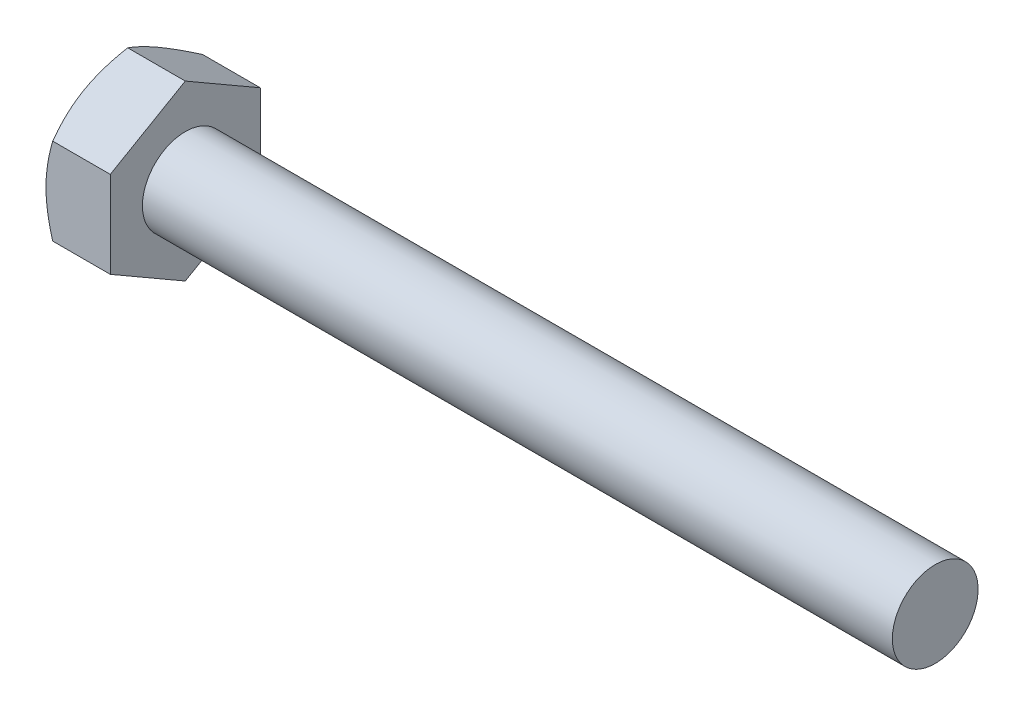
ISO-10303-21;
HEADER;
FILE_DESCRIPTION(('STEP AP214'),'2;1');
FILE_NAME('part.step','',(''),(''),'','','');
FILE_SCHEMA(('AUTOMOTIVE_DESIGN { 1 0 10303 214 1 1 1 1 }'));
ENDSEC;
DATA;
#1=APPLICATION_CONTEXT('core data for automotive mechanical design processes');
#2=APPLICATION_PROTOCOL_DEFINITION('international standard','automotive_design',2000,#1);
#3=PRODUCT_CONTEXT('',#1,'mechanical');
#4=PRODUCT('Part','Part','',(#3));
#5=PRODUCT_RELATED_PRODUCT_CATEGORY('part','',(#4));
#6=PRODUCT_DEFINITION_FORMATION('','',#4);
#7=PRODUCT_DEFINITION_CONTEXT('part definition',#1,'design');
#8=PRODUCT_DEFINITION('design','',#6,#7);
#9=PRODUCT_DEFINITION_SHAPE('','',#8);
#10=(LENGTH_UNIT() NAMED_UNIT(*) SI_UNIT(.MILLI.,.METRE.));
#11=(NAMED_UNIT(*) PLANE_ANGLE_UNIT() SI_UNIT($,.RADIAN.));
#12=(NAMED_UNIT(*) SI_UNIT($,.STERADIAN.) SOLID_ANGLE_UNIT());
#13=UNCERTAINTY_MEASURE_WITH_UNIT(LENGTH_MEASURE(1.E-05),#10,'distance_accuracy_value','');
#14=(GEOMETRIC_REPRESENTATION_CONTEXT(3) GLOBAL_UNCERTAINTY_ASSIGNED_CONTEXT((#13)) GLOBAL_UNIT_ASSIGNED_CONTEXT((#10,
#11,#12)) REPRESENTATION_CONTEXT('',''));
#15=CARTESIAN_POINT('',(0.,0.,0.));
#16=DIRECTION('',(0.,0.,1.));
#17=DIRECTION('',(1.,0.,0.));
#18=AXIS2_PLACEMENT_3D('',#15,#16,#17);
#19=CARTESIAN_POINT('',(0.375,0.,0.));
#20=DIRECTION('',(1.,0.,0.));
#21=DIRECTION('',(0.,0.,-1.));
#22=AXIS2_PLACEMENT_3D('',#19,#20,#21);
#23=PLANE('',#22);
#24=CARTESIAN_POINT('',(0.375,0.,0.));
#25=DIRECTION('',(-1.,0.,0.));
#26=DIRECTION('',(0.,0.,1.));
#27=AXIS2_PLACEMENT_3D('',#24,#25,#26);
#28=CIRCLE('',#27,3.0625);
#29=CARTESIAN_POINT('',(0.375,0.,3.0625));
#30=VERTEX_POINT('',#29);
#31=EDGE_CURVE('E20',#30,#30,#28,.T.);
#32=ORIENTED_EDGE('',*,*,#31,.T.);
#33=EDGE_LOOP('',(#32));
#34=FACE_BOUND('',#33,.T.);
#35=ADVANCED_FACE('F17',(#34),#23,.F.);
#36=CARTESIAN_POINT('',(0.375,0.,0.));
#37=DIRECTION('',(-1.,0.,0.));
#38=DIRECTION('',(0.,0.,1.));
#39=AXIS2_PLACEMENT_3D('',#36,#37,#38);
#40=CYLINDRICAL_SURFACE('',#39,3.0625);
#41=ORIENTED_EDGE('',*,*,#31,.F.);
#42=EDGE_LOOP('',(#41));
#43=FACE_BOUND('',#42,.T.);
#44=CARTESIAN_POINT('',(0.,0.,0.));
#45=DIRECTION('',(-1.,0.,0.));
#46=DIRECTION('',(0.,0.,1.));
#47=AXIS2_PLACEMENT_3D('',#44,#45,#46);
#48=CIRCLE('',#47,3.0625);
#49=CARTESIAN_POINT('',(0.,0.,3.0625));
#50=VERTEX_POINT('',#49);
#51=EDGE_CURVE('E95',#50,#50,#48,.F.);
#52=ORIENTED_EDGE('',*,*,#51,.F.);
#53=EDGE_LOOP('',(#52));
#54=FACE_BOUND('',#53,.T.);
#55=ADVANCED_FACE('F313',(#43,#54),#40,.F.);
#56=CARTESIAN_POINT('',(0.,0.,0.));
#57=DIRECTION('',(-1.,0.,0.));
#58=DIRECTION('',(0.,0.,1.));
#59=AXIS2_PLACEMENT_3D('',#56,#57,#58);
#60=PLANE('',#59);
#61=ORIENTED_EDGE('',*,*,#51,.T.);
#62=EDGE_LOOP('',(#61));
#63=FACE_BOUND('',#62,.T.);
#64=CARTESIAN_POINT('',(5.01101449831148E-09,0.,0.));
#65=DIRECTION('',(1.,0.,0.));
#66=DIRECTION('',(0.,0.,-1.));
#67=AXIS2_PLACEMENT_3D('',#64,#65,#66);
#68=CIRCLE('',#67,3.50000000855744);
#69=CARTESIAN_POINT('',(3.36294919751292E-09,-3.03108891986821,1.75000001147091));
#70=VERTEX_POINT('',#69);
#71=CARTESIAN_POINT('',(5.82945458951723E-09,-3.03108891860666,-1.75000001074256));
#72=VERTEX_POINT('',#71);
#73=EDGE_CURVE('E300',#70,#72,#68,.T.);
#74=ORIENTED_EDGE('',*,*,#73,.F.);
#75=CARTESIAN_POINT('',(3.28185287105931E-11,0.,0.));
#76=DIRECTION('',(1.,0.,0.));
#77=DIRECTION('',(0.,0.,-1.));
#78=AXIS2_PLACEMENT_3D('',#75,#76,#77);
#79=CIRCLE('',#78,3.49999999997408);
#80=CARTESIAN_POINT('',(2.51062004844559E-09,0.,3.49999999998704));
#81=VERTEX_POINT('',#80);
#82=EDGE_CURVE('E442',#81,#70,#79,.T.);
#83=ORIENTED_EDGE('',*,*,#82,.F.);
#84=CARTESIAN_POINT('',(4.98842156818058E-09,0.,0.));
#85=DIRECTION('',(1.,0.,0.));
#86=DIRECTION('',(0.,0.,-1.));
#87=AXIS2_PLACEMENT_3D('',#84,#85,#86);
#88=CIRCLE('',#87,3.50000000855744);
#89=CARTESIAN_POINT('',(5.82951793613482E-09,3.03108891860675,1.75000001074261));
#90=VERTEX_POINT('',#89);
#91=EDGE_CURVE('E91',#90,#81,#88,.T.);
#92=ORIENTED_EDGE('',*,*,#91,.F.);
#93=CARTESIAN_POINT('',(5.01101449831148E-09,0.,0.));
#94=DIRECTION('',(1.,0.,0.));
#95=DIRECTION('',(0.,0.,-1.));
#96=AXIS2_PLACEMENT_3D('',#93,#94,#95);
#97=CIRCLE('',#96,3.50000000855744);
#98=CARTESIAN_POINT('',(3.36301387464088E-09,3.0310889198684,-1.75000001147103));
#99=VERTEX_POINT('',#98);
#100=EDGE_CURVE('E85',#99,#90,#97,.T.);
#101=ORIENTED_EDGE('',*,*,#100,.F.);
#102=CARTESIAN_POINT('',(3.28185287105931E-11,0.,0.));
#103=DIRECTION('',(1.,0.,0.));
#104=DIRECTION('',(0.,0.,-1.));
#105=AXIS2_PLACEMENT_3D('',#102,#103,#104);
#106=CIRCLE('',#105,3.49999999997408);
#107=CARTESIAN_POINT('',(2.51062004844559E-09,0.,-3.49999999998704));
#108=VERTEX_POINT('',#107);
#109=EDGE_CURVE('E88',#108,#99,#106,.T.);
#110=ORIENTED_EDGE('',*,*,#109,.F.);
#111=CARTESIAN_POINT('',(4.98842156818058E-09,0.,0.));
#112=DIRECTION('',(1.,0.,0.));
#113=DIRECTION('',(0.,0.,-1.));
#114=AXIS2_PLACEMENT_3D('',#111,#112,#113);
#115=CIRCLE('',#114,3.50000000855744);
#116=EDGE_CURVE('E106',#72,#108,#115,.T.);
#117=ORIENTED_EDGE('',*,*,#116,.F.);
#118=EDGE_LOOP('',(#74,#83,#92,#101,#110,#117));
#119=FACE_BOUND('',#118,.T.);
#120=ADVANCED_FACE('F87',(#63,#119),#60,.T.);
#121=CARTESIAN_POINT('',(0.314483045826819,0.,0.));
#122=DIRECTION('',(1.,0.,0.));
#123=DIRECTION('',(0.,0.,-1.));
#124=AXIS2_PLACEMENT_3D('',#121,#122,#123);
#125=CONICAL_SURFACE('',#124,4.04470061340589,1.04719755122579);
#126=CARTESIAN_POINT('',(6.58395533186401E-09,3.03108892003228,-1.75000001156564));
#127=CARTESIAN_POINT('',(-1.42977159285739E-05,3.07397316047305,-1.67572232836024));
#128=CARTESIAN_POINT('',(0.00181986003295548,3.11685533509692,-1.60144822339775));
#129=CARTESIAN_POINT('',(0.00907878229430276,3.20253548464054,-1.45304585176378));
#130=CARTESIAN_POINT('',(0.0145028359800236,3.24533347454722,-1.37891755913418));
#131=CARTESIAN_POINT('',(0.0287995156351535,3.33056881353549,-1.23128562207073));
#132=CARTESIAN_POINT('',(0.0376547807204094,3.37300689620831,-1.15778070701977));
#133=CARTESIAN_POINT('',(0.0586234030208736,3.45768087184935,-1.0111210797662));
#134=CARTESIAN_POINT('',(0.0707368459937924,3.49991675946585,-0.937966376833024));
#135=CARTESIAN_POINT('',(0.111590225612653,3.62614605846092,-0.719330818528087));
#136=CARTESIAN_POINT('',(0.144863050212181,3.7097727689926,-0.574485107649345));
#137=CARTESIAN_POINT('',(0.221598694038541,3.87630703706425,-0.286039295406477));
#138=CARTESIAN_POINT('',(0.265112403858701,3.95920878573871,-0.142449255292499));
#139=CARTESIAN_POINT('',(0.3126074014121,4.04145190198245,-1.00029996520202E-11));
#140=B_SPLINE_CURVE_WITH_KNOTS('',3,(#126,#127,#128,#129,#130,#131,#132,#133,#134,#135,#136,
#137,#138,#139),.UNSPECIFIED.,.F.,.F.,(4,2,2,2,2,2,4),(0.,0.25727918394602,0.514507439888531,
0.770450845442357,1.02640098827985,1.53763043405243,2.05145609891354),.UNSPECIFIED.);
#141=CARTESIAN_POINT('',(0.312607401413537,4.04145190198494,5.6845955636872E-12));
#142=VERTEX_POINT('',#141);
#143=EDGE_CURVE('E109',#99,#142,#140,.T.);
#144=ORIENTED_EDGE('',*,*,#143,.F.);
#145=ORIENTED_EDGE('',*,*,#100,.T.);
#146=CARTESIAN_POINT('',(0.312607401406135,4.04145190199034,1.4551331657345E-11));
#147=CARTESIAN_POINT('',(0.265112403853278,3.95920878573749,0.142449255302942));
#148=CARTESIAN_POINT('',(0.221598694032759,3.87630703705593,0.286039295423528));
#149=CARTESIAN_POINT('',(0.144863050205331,3.70977276897354,0.574485107679731));
#150=CARTESIAN_POINT('',(0.111590225605015,3.6261460584382,0.719330818565179));
#151=CARTESIAN_POINT('',(0.0707368459849721,3.49991675943816,0.937966376882104));
#152=CARTESIAN_POINT('',(0.0586234030116029,3.45768087181976,1.01112107982014));
#153=CARTESIAN_POINT('',(0.0376547807131931,3.37300689617133,1.15778070708112));
#154=CARTESIAN_POINT('',(0.028799515630432,3.330568813493,1.23128562213461));
#155=CARTESIAN_POINT('',(0.0145028359709955,3.24533347450785,1.37891755921214));
#156=CARTESIAN_POINT('',(0.0090787822784645,3.20253548460986,1.45304585185333));
#157=CARTESIAN_POINT('',(0.00181986004038579,3.11685533502827,1.60144822348023));
#158=CARTESIAN_POINT('',(-1.42976783805067E-05,3.07397316035773,1.67572232842407));
#159=CARTESIAN_POINT('',(6.69320725986198E-09,3.03108891980792,1.75000001157577));
#160=B_SPLINE_CURVE_WITH_KNOTS('',3,(#146,#147,#148,#149,#150,#151,#152,#153,#154,#155,#156,
#157,#158,#159),.UNSPECIFIED.,.F.,.F.,(4,2,2,2,2,2,4),(0.,0.513825664888411,1.02505511068407,
1.28100525353686,1.53694865910518,1.79417691506502,2.05145609903063),.UNSPECIFIED.);
#161=EDGE_CURVE('E112',#142,#90,#160,.T.);
#162=ORIENTED_EDGE('',*,*,#161,.F.);
#163=EDGE_LOOP('',(#144,#145,#162));
#164=FACE_BOUND('',#163,.T.);
#165=ADVANCED_FACE('F110',(#164),#125,.T.);
#166=CARTESIAN_POINT('',(0.314483038096114,0.,0.));
#167=DIRECTION('',(1.,0.,0.));
#168=DIRECTION('',(0.,0.,-1.));
#169=AXIS2_PLACEMENT_3D('',#166,#167,#168);
#170=CONICAL_SURFACE('',#169,4.04470059999085,1.04719755117475);
#171=CARTESIAN_POINT('',(4.77845987891477E-11,0.,-3.5));
#172=CARTESIAN_POINT('',(-1.43043220471984E-05,0.0857684805326206,-3.5));
#173=CARTESIAN_POINT('',(0.00181985339243012,0.171532829306667,-3.5));
#174=CARTESIAN_POINT('',(0.00907877561014534,0.342893127336807,-3.5));
#175=CARTESIAN_POINT('',(0.0145028292866035,0.428489106566764,-3.5));
#176=CARTESIAN_POINT('',(0.0287995089025173,0.598959783409673,-3.5));
#177=CARTESIAN_POINT('',(0.0376547739578833,0.68383594820495,-3.5));
#178=CARTESIAN_POINT('',(0.0586233961907943,0.853183898381508,-3.5));
#179=CARTESIAN_POINT('',(0.0707368391260599,0.93765567305936,-3.5));
#180=CARTESIAN_POINT('',(0.111590218616639,1.19011426938964,-3.5));
#181=CARTESIAN_POINT('',(0.144863043110373,1.35736768935488,-3.5));
#182=CARTESIAN_POINT('',(0.221598686692807,1.69043622331236,-3.5));
#183=CARTESIAN_POINT('',(0.265112396374761,1.85623971957364,-3.5));
#184=CARTESIAN_POINT('',(0.312607393778042,2.02072595097929,-3.5));
#185=B_SPLINE_CURVE_WITH_KNOTS('',3,(#171,#172,#173,#174,#175,#176,#177,#178,#179,#180,#181,
#182,#183,#184),.UNSPECIFIED.,.F.,.F.,(4,2,2,2,2,2,4),(0.,0.257279183107973,0.514507438210285,
0.770450842925181,1.02640098492455,1.5376304290158,2.0514560921915),.UNSPECIFIED.);
#186=CARTESIAN_POINT('',(0.312607393779895,2.02072595099841,-3.49999999999267));
#187=VERTEX_POINT('',#186);
#188=EDGE_CURVE('E104',#108,#187,#185,.T.);
#189=ORIENTED_EDGE('',*,*,#188,.F.);
#190=ORIENTED_EDGE('',*,*,#109,.T.);
#191=CARTESIAN_POINT('',(0.312607393770353,2.02072595101179,-3.49999999999298));
#192=CARTESIAN_POINT('',(0.265112397282745,2.102969066205,-3.35755074651281));
#193=CARTESIAN_POINT('',(0.221598688477232,2.18587081381745,-3.2139607082332));
#194=CARTESIAN_POINT('',(0.14486304648416,2.35240507974713,-2.925514899698));
#195=CARTESIAN_POINT('',(0.111590222705085,2.43603178919911,-2.78066919069208));
#196=CARTESIAN_POINT('',(0.0707368441166263,2.56226108654409,-2.56203363524285));
#197=CARTESIAN_POINT('',(0.0586234014540708,2.60449697360432,-2.48887893327133));
#198=CARTESIAN_POINT('',(0.0376547796983038,2.68917094812918,-2.34221930795627));
#199=CARTESIAN_POINT('',(0.0287995148473805,2.73160903024209,-2.26871439388217));
#200=CARTESIAN_POINT('',(0.0145028355647568,2.81684436808392,-2.12108245878498));
#201=CARTESIAN_POINT('',(0.0090787820164345,2.85964235740397,-2.0469541671448));
#202=CARTESIAN_POINT('',(0.00181985997123214,2.94532250582611,-1.89855179752609));
#203=CARTESIAN_POINT('',(-1.42976989230399E-05,2.98820467991515,-1.82427769358943));
#204=CARTESIAN_POINT('',(6.6706163955045E-09,3.03108891988335,-1.75000001144512));
#205=B_SPLINE_CURVE_WITH_KNOTS('',3,(#191,#192,#193,#194,#195,#196,#197,#198,#199,#200,#201,
#202,#203,#204),.UNSPECIFIED.,.F.,.F.,(4,2,2,2,2,2,4),(0.,0.51382565795075,1.02505509689228,
1.28100523630037,1.53694863842459,1.79417689089934,2.05145607137649),.UNSPECIFIED.);
#206=EDGE_CURVE('E101',#187,#99,#205,.T.);
#207=ORIENTED_EDGE('',*,*,#206,.F.);
#208=EDGE_LOOP('',(#189,#190,#207));
#209=FACE_BOUND('',#208,.T.);
#210=ADVANCED_FACE('F99',(#209),#170,.T.);
#211=CARTESIAN_POINT('',(0.314483038096114,0.,0.));
#212=DIRECTION('',(1.,0.,0.));
#213=DIRECTION('',(0.,0.,-1.));
#214=AXIS2_PLACEMENT_3D('',#211,#212,#213);
#215=CONICAL_SURFACE('',#214,4.04470059999085,1.04719755117475);
#216=CARTESIAN_POINT('',(6.25715272808812E-09,-3.03108892048821,-1.75000001182887));
#217=CARTESIAN_POINT('',(-1.4297847169201E-05,-2.98820468012886,-1.82427769373297));
#218=CARTESIAN_POINT('',(0.001819859931646,-2.94532250588143,-1.89855179756759));
#219=CARTESIAN_POINT('',(0.00907878205592961,-2.85964235734624,-2.04695416710662));
#220=CARTESIAN_POINT('',(0.0145028355748215,-2.81684436807152,-2.12108245876912));
#221=CARTESIAN_POINT('',(0.0287995148355072,-2.73160903026361,-2.26871439388116));
#222=CARTESIAN_POINT('',(0.0376547796938746,-2.68917094813958,-2.34221930794795));
#223=CARTESIAN_POINT('',(0.0586234014548858,-2.60449697360712,-2.4888789332559));
#224=CARTESIAN_POINT('',(0.0707368441152022,-2.5622610865504,-2.56203363522762));
#225=CARTESIAN_POINT('',(0.111590222700327,-2.43603178920829,-2.78066919068346));
#226=CARTESIAN_POINT('',(0.144863046480872,-2.35240507975256,-2.92551489969397));
#227=CARTESIAN_POINT('',(0.22159868847886,-2.18587081381474,-3.21396070823162));
#228=CARTESIAN_POINT('',(0.265112397287546,-2.10296906619785,-3.35755074650914));
#229=CARTESIAN_POINT('',(0.312607393777966,-2.02072595100136,-3.49999999998711));
#230=B_SPLINE_CURVE_WITH_KNOTS('',3,(#216,#217,#218,#219,#220,#221,#222,#223,#224,#225,#226,
#227,#228,#229),.UNSPECIFIED.,.F.,.F.,(4,2,2,2,2,2,4),(0.,0.257279180456604,0.514507432919479,
0.770450835041813,1.02640097444493,1.53763041340382,2.05145607135741),.UNSPECIFIED.);
#231=CARTESIAN_POINT('',(0.312607393779819,-2.02072595098545,-3.5));
#232=VERTEX_POINT('',#231);
#233=EDGE_CURVE('E182',#72,#232,#230,.T.);
#234=ORIENTED_EDGE('',*,*,#233,.F.);
#235=ORIENTED_EDGE('',*,*,#116,.T.);
#236=CARTESIAN_POINT('',(0.312607393770277,-2.02072595097903,-3.50000000001174));
#237=CARTESIAN_POINT('',(0.265112396371761,-1.85623971957243,-3.5000000000041));
#238=CARTESIAN_POINT('',(0.221598686691756,-1.69043622331093,-3.50000000000107));
#239=CARTESIAN_POINT('',(0.144863043110787,-1.35736768935357,-3.49999999999893));
#240=CARTESIAN_POINT('',(0.111590218616585,-1.19011426938867,-3.49999999999981));
#241=CARTESIAN_POINT('',(0.0707368391258948,-0.937655673058672,-3.5000000000001));
#242=CARTESIAN_POINT('',(0.0586233961906879,-0.853183898380853,-3.50000000000003));
#243=CARTESIAN_POINT('',(0.0376547739578351,-0.683835948204367,-3.49999999999997));
#244=CARTESIAN_POINT('',(0.0287995089024689,-0.598959783409128,-3.49999999999999));
#245=CARTESIAN_POINT('',(0.0145028292865692,-0.428489106566333,-3.50000000000001));
#246=CARTESIAN_POINT('',(0.00907877561012371,-0.342893127336452,-3.5));
#247=CARTESIAN_POINT('',(0.0018198533924282,-0.171532829306482,-3.5));
#248=CARTESIAN_POINT('',(-1.43043220427263E-05,-0.085768480532529,-3.49999999999999));
#249=CARTESIAN_POINT('',(4.77845871424773E-11,0.,-3.5));
#250=B_SPLINE_CURVE_WITH_KNOTS('',3,(#236,#237,#238,#239,#240,#241,#242,#243,#244,#245,#246,
#247,#248,#249),.UNSPECIFIED.,.F.,.F.,(4,2,2,2,2,2,4),(0.,0.513825663174873,1.02505510726551,
1.28100524926473,1.53694865397952,1.7941769090816,2.05145609218929),.UNSPECIFIED.);
#251=EDGE_CURVE('E158',#232,#108,#250,.T.);
#252=ORIENTED_EDGE('',*,*,#251,.F.);
#253=EDGE_LOOP('',(#234,#235,#252));
#254=FACE_BOUND('',#253,.T.);
#255=ADVANCED_FACE('F146',(#254),#215,.T.);
#256=CARTESIAN_POINT('',(0.314483045826819,0.,0.));
#257=DIRECTION('',(1.,0.,0.));
#258=DIRECTION('',(0.,0.,-1.));
#259=AXIS2_PLACEMENT_3D('',#256,#257,#258);
#260=CONICAL_SURFACE('',#259,4.04470061340589,1.04719755122579);
#261=CARTESIAN_POINT('',(0.312607401405987,-4.04145190199008,-1.45576505297843E-11));
#262=CARTESIAN_POINT('',(0.265112403853133,-3.95920878573723,-0.142449255302939));
#263=CARTESIAN_POINT('',(0.221598694032617,-3.87630703705568,-0.286039295423516));
#264=CARTESIAN_POINT('',(0.144863050205194,-3.7097727689733,-0.574485107679701));
#265=CARTESIAN_POINT('',(0.111590225604882,-3.62614605843797,-0.719330818565139));
#266=CARTESIAN_POINT('',(0.0707368459848408,-3.49991675943793,-0.937966376882051));
#267=CARTESIAN_POINT('',(0.0586234030114722,-3.45768087181954,-1.01112107982008));
#268=CARTESIAN_POINT('',(0.0376547807130637,-3.37300689617111,-1.15778070708105));
#269=CARTESIAN_POINT('',(0.0287995156303032,-3.33056881349278,-1.23128562213454));
#270=CARTESIAN_POINT('',(0.014502835970868,-3.24533347450764,-1.37891755921205));
#271=CARTESIAN_POINT('',(0.00907878227833743,-3.20253548460966,-1.45304585185324));
#272=CARTESIAN_POINT('',(0.00181986004025929,-3.11685533502807,-1.60144822348014));
#273=CARTESIAN_POINT('',(-1.42976785069235E-05,-3.07397316035754,-1.67572232842396));
#274=CARTESIAN_POINT('',(6.69308061671484E-09,-3.03108891980773,-1.75000001157566));
#275=B_SPLINE_CURVE_WITH_KNOTS('',3,(#261,#262,#263,#264,#265,#266,#267,#268,#269,#270,#271,
#272,#273,#274),.UNSPECIFIED.,.F.,.F.,(4,2,2,2,2,2,4),(0.,0.513825664888378,1.025055110684,
1.28100525353678,1.53694865910508,1.7941769150649,2.0514560990305),.UNSPECIFIED.);
#276=CARTESIAN_POINT('',(0.312607401413389,-4.04145190198468,-5.69099525446076E-12));
#277=VERTEX_POINT('',#276);
#278=EDGE_CURVE('E159',#277,#72,#275,.T.);
#279=ORIENTED_EDGE('',*,*,#278,.F.);
#280=CARTESIAN_POINT('',(6.58382203403228E-09,-3.03108892003209,1.75000001156553));
#281=CARTESIAN_POINT('',(-1.42977160590931E-05,-3.07397316047286,1.67572232836014));
#282=CARTESIAN_POINT('',(0.0018198600328258,-3.11685533509672,1.60144822339765));
#283=CARTESIAN_POINT('',(0.00907878229417315,-3.20253548464034,1.45304585176369));
#284=CARTESIAN_POINT('',(0.0145028359798932,-3.24533347454702,1.37891755913409));
#285=CARTESIAN_POINT('',(0.0287995156350222,-3.33056881353528,1.23128562207065));
#286=CARTESIAN_POINT('',(0.0376547807202779,-3.37300689620809,1.1577807070197));
#287=CARTESIAN_POINT('',(0.058623403020741,-3.45768087184913,1.01112107976613));
#288=CARTESIAN_POINT('',(0.0707368459936589,-3.49991675946563,0.937966376832961));
#289=CARTESIAN_POINT('',(0.111590225612516,-3.62614605846068,0.719330818528038));
#290=CARTESIAN_POINT('',(0.144863050212043,-3.70977276899237,0.574485107649304));
#291=CARTESIAN_POINT('',(0.221598694038398,-3.87630703706401,0.286039295406454));
#292=CARTESIAN_POINT('',(0.265112403858556,-3.95920878573846,0.142449255292485));
#293=CARTESIAN_POINT('',(0.312607401411952,-4.04145190198219,9.9971402420643E-12));
#294=B_SPLINE_CURVE_WITH_KNOTS('',3,(#280,#281,#282,#283,#284,#285,#286,#287,#288,#289,#290,
#291,#292,#293),.UNSPECIFIED.,.F.,.F.,(4,2,2,2,2,2,4),(0.,0.257279183946004,0.5145074398885,
0.77045084544231,1.02640098827979,1.53763043405234,2.05145609891341),.UNSPECIFIED.);
#295=EDGE_CURVE('E196',#70,#277,#294,.T.);
#296=ORIENTED_EDGE('',*,*,#295,.F.);
#297=ORIENTED_EDGE('',*,*,#73,.T.);
#298=EDGE_LOOP('',(#279,#296,#297));
#299=FACE_BOUND('',#298,.T.);
#300=ADVANCED_FACE('F299',(#299),#260,.T.);
#301=CARTESIAN_POINT('',(0.314483038096114,0.,0.));
#302=DIRECTION('',(1.,0.,0.));
#303=DIRECTION('',(0.,0.,-1.));
#304=AXIS2_PLACEMENT_3D('',#301,#302,#303);
#305=CONICAL_SURFACE('',#304,4.04470059999085,1.04719755117475);
#306=CARTESIAN_POINT('',(0.31260739377035,2.02072595097929,3.50000000001174));
#307=CARTESIAN_POINT('',(0.265112396371823,1.85623971957266,3.5000000000041));
#308=CARTESIAN_POINT('',(0.221598686691808,1.69043622331114,3.50000000000107));
#309=CARTESIAN_POINT('',(0.144863043110821,1.35736768935374,3.49999999999893));
#310=CARTESIAN_POINT('',(0.111590218616612,1.19011426938882,3.4999999999998));
#311=CARTESIAN_POINT('',(0.0707368391259112,0.937655673058793,3.5000000000001));
#312=CARTESIAN_POINT('',(0.0586233961907012,0.853183898380964,3.50000000000002));
#313=CARTESIAN_POINT('',(0.0376547739578431,0.683835948204456,3.49999999999997));
#314=CARTESIAN_POINT('',(0.0287995089024748,0.598959783409206,3.49999999999999));
#315=CARTESIAN_POINT('',(0.0145028292865715,0.428489106566389,3.50000000000001));
#316=CARTESIAN_POINT('',(0.00907877561012448,0.342893127336498,3.5));
#317=CARTESIAN_POINT('',(0.00181985339242692,0.171532829306505,3.49999999999999));
#318=CARTESIAN_POINT('',(-1.4304322044562E-05,0.0857684805325405,3.49999999999999));
#319=CARTESIAN_POINT('',(4.7782831772573E-11,0.,3.5));
#320=B_SPLINE_CURVE_WITH_KNOTS('',3,(#306,#307,#308,#309,#310,#311,#312,#313,#314,#315,#316,
#317,#318,#319),.UNSPECIFIED.,.F.,.F.,(4,2,2,2,2,2,4),(0.,0.513825663174939,1.02505510726564,
1.2810052492649,1.53694865397972,1.79417690908183,2.05145609218956),.UNSPECIFIED.);
#321=CARTESIAN_POINT('',(0.312607393777448,2.02072595098994,3.49999999999266));
#322=VERTEX_POINT('',#321);
#323=EDGE_CURVE('E218',#322,#81,#320,.T.);
#324=ORIENTED_EDGE('',*,*,#323,.F.);
#325=CARTESIAN_POINT('',(6.25728336489911E-09,3.03108892048839,1.75000001182898));
#326=CARTESIAN_POINT('',(-1.42978470413779E-05,2.98820468012906,1.82427769373307));
#327=CARTESIAN_POINT('',(0.0018198599317724,2.94532250588162,1.89855179756769));
#328=CARTESIAN_POINT('',(0.00907878205605393,2.85964235734644,2.04695416710671));
#329=CARTESIAN_POINT('',(0.0145028355749451,2.81684436807173,2.1210824587692));
#330=CARTESIAN_POINT('',(0.0287995148356283,2.73160903026383,2.26871439388123));
#331=CARTESIAN_POINT('',(0.0376547796939938,2.6891709481398,2.34221930794802));
#332=CARTESIAN_POINT('',(0.058623401455001,2.60449697360734,2.48887893325596));
#333=CARTESIAN_POINT('',(0.0707368441153153,2.56226108655062,2.56203363522768));
#334=CARTESIAN_POINT('',(0.111590222700433,2.43603178920852,2.78066919068351));
#335=CARTESIAN_POINT('',(0.144863046480971,2.35240507975279,2.925514899694));
#336=CARTESIAN_POINT('',(0.221598688478947,2.18587081381498,3.21396070823164));
#337=CARTESIAN_POINT('',(0.265112397287625,2.1029690661981,3.35755074650915));
#338=CARTESIAN_POINT('',(0.312607393778039,2.02072595100162,3.49999999998711));
#339=B_SPLINE_CURVE_WITH_KNOTS('',3,(#325,#326,#327,#328,#329,#330,#331,#332,#333,#334,#335,
#336,#337,#338),.UNSPECIFIED.,.F.,.F.,(4,2,2,2,2,2,4),(0.,0.257279180456587,0.514507432919445,
0.770450835041762,1.02640097444486,1.53763041340372,2.05145607135727),.UNSPECIFIED.);
#340=EDGE_CURVE('E122',#90,#322,#339,.T.);
#341=ORIENTED_EDGE('',*,*,#340,.F.);
#342=ORIENTED_EDGE('',*,*,#91,.T.);
#343=EDGE_LOOP('',(#324,#341,#342));
#344=FACE_BOUND('',#343,.T.);
#345=ADVANCED_FACE('F205',(#344),#305,.T.);
#346=CARTESIAN_POINT('',(0.314483038096114,0.,0.));
#347=DIRECTION('',(1.,0.,0.));
#348=DIRECTION('',(0.,0.,-1.));
#349=AXIS2_PLACEMENT_3D('',#346,#347,#348);
#350=CONICAL_SURFACE('',#349,4.04470059999085,1.04719755117475);
#351=CARTESIAN_POINT('',(0.312607393770278,-2.02072595101153,3.49999999999298));
#352=CARTESIAN_POINT('',(0.265112397282663,-2.10296906620475,3.3575507465128));
#353=CARTESIAN_POINT('',(0.221598688477143,-2.1858708138172,3.21396070823318));
#354=CARTESIAN_POINT('',(0.144863046484057,-2.3524050797469,2.92551489969797));
#355=CARTESIAN_POINT('',(0.111590222704977,-2.43603178919888,2.78066919069203));
#356=CARTESIAN_POINT('',(0.0707368441165104,-2.56226108654387,2.56203363524279));
#357=CARTESIAN_POINT('',(0.0586234014539527,-2.6044969736041,2.48887893327126));
#358=CARTESIAN_POINT('',(0.0376547796981818,-2.68917094812897,2.34221930795619));
#359=CARTESIAN_POINT('',(0.0287995148472568,-2.73160903024188,2.26871439388209));
#360=CARTESIAN_POINT('',(0.0145028355646305,-2.81684436808372,2.12108245878489));
#361=CARTESIAN_POINT('',(0.00907878201630731,-2.85964235740376,2.04695416714471));
#362=CARTESIAN_POINT('',(0.00181985997110368,-2.94532250582592,1.89855179752599));
#363=CARTESIAN_POINT('',(-1.42976990519232E-05,-2.98820467991495,1.82427769358932));
#364=CARTESIAN_POINT('',(6.67048705463224E-09,-3.03108891988316,1.75000001144501));
#365=B_SPLINE_CURVE_WITH_KNOTS('',3,(#351,#352,#353,#354,#355,#356,#357,#358,#359,#360,#361,
#362,#363,#364),.UNSPECIFIED.,.F.,.F.,(4,2,2,2,2,2,4),(0.,0.513825657950784,1.02505509689235,
1.28100523630045,1.53694863842469,1.79417689089946,2.05145607137663),.UNSPECIFIED.);
#366=CARTESIAN_POINT('',(0.312607393779819,-2.02072595099815,3.49999999999267));
#367=VERTEX_POINT('',#366);
#368=EDGE_CURVE('E189',#367,#70,#365,.T.);
#369=ORIENTED_EDGE('',*,*,#368,.F.);
#370=CARTESIAN_POINT('',(4.77828473628659E-11,0.,3.5));
#371=CARTESIAN_POINT('',(-1.4304322049224E-05,-0.0857684805326092,3.5));
#372=CARTESIAN_POINT('',(0.00181985339242763,-0.171532829306644,3.5));
#373=CARTESIAN_POINT('',(0.00907877561014116,-0.342893127336762,3.5));
#374=CARTESIAN_POINT('',(0.0145028292865981,-0.428489106566708,3.5));
#375=CARTESIAN_POINT('',(0.0287995089025082,-0.598959783409595,3.5));
#376=CARTESIAN_POINT('',(0.0376547739578719,-0.683835948204862,3.5));
#377=CARTESIAN_POINT('',(0.0586233961907775,-0.853183898381397,3.5));
#378=CARTESIAN_POINT('',(0.0707368391260401,-0.937655673059239,3.5));
#379=CARTESIAN_POINT('',(0.111590218616609,-1.19011426938949,3.5));
#380=CARTESIAN_POINT('',(0.144863043110336,-1.35736768935471,3.5));
#381=CARTESIAN_POINT('',(0.221598686692751,-1.69043622331214,3.5));
#382=CARTESIAN_POINT('',(0.265112396374695,-1.8562397195734,3.5));
#383=CARTESIAN_POINT('',(0.312607393777966,-2.02072595097903,3.5));
#384=B_SPLINE_CURVE_WITH_KNOTS('',3,(#370,#371,#372,#373,#374,#375,#376,#377,#378,#379,#380,
#381,#382,#383),.UNSPECIFIED.,.F.,.F.,(4,2,2,2,2,2,4),(0.,0.25727918310794,0.514507438210218,
0.770450842925081,1.02640098492442,1.5376304290156,2.05145609219124),.UNSPECIFIED.);
#385=EDGE_CURVE('E211',#81,#367,#384,.T.);
#386=ORIENTED_EDGE('',*,*,#385,.F.);
#387=ORIENTED_EDGE('',*,*,#82,.T.);
#388=EDGE_LOOP('',(#369,#386,#387));
#389=FACE_BOUND('',#388,.T.);
#390=ADVANCED_FACE('F201',(#389),#350,.T.);
#391=CARTESIAN_POINT('',(3.,2.02072595099418,3.5));
#392=DIRECTION('',(0.,0.866025402838329,0.50000000163871));
#393=DIRECTION('',(0.,-0.50000000163871,0.866025402838329));
#394=AXIS2_PLACEMENT_3D('',#391,#392,#393);
#395=PLANE('',#394);
#396=ORIENTED_EDGE('',*,*,#161,.T.);
#397=ORIENTED_EDGE('',*,*,#340,.T.);
#398=DIRECTION('',(1.,0.,0.));
#399=VECTOR('',#398,1.);
#400=CARTESIAN_POINT('',(3.,2.02072595099418,3.5));
#401=LINE('',#400,#399);
#402=CARTESIAN_POINT('',(3.,2.02072595099418,3.5));
#403=VERTEX_POINT('',#402);
#404=EDGE_CURVE('E449',#403,#322,#401,.F.);
#405=ORIENTED_EDGE('',*,*,#404,.F.);
#406=DIRECTION('',(0.,0.50000000163871,-0.866025402838329));
#407=VECTOR('',#406,1.);
#408=CARTESIAN_POINT('',(3.,2.02072595099418,3.5));
#409=LINE('',#408,#407);
#410=CARTESIAN_POINT('',(3.,4.04145190198822,0.));
#411=VERTEX_POINT('',#410);
#412=EDGE_CURVE('E217',#403,#411,#409,.T.);
#413=ORIENTED_EDGE('',*,*,#412,.T.);
#414=DIRECTION('',(1.,0.,0.));
#415=VECTOR('',#414,1.);
#416=CARTESIAN_POINT('',(3.,4.04145190198822,0.));
#417=LINE('',#416,#415);
#418=EDGE_CURVE('E120',#142,#411,#417,.T.);
#419=ORIENTED_EDGE('',*,*,#418,.F.);
#420=EDGE_LOOP('',(#396,#397,#405,#413,#419));
#421=FACE_BOUND('',#420,.T.);
#422=ADVANCED_FACE('F204',(#421),#395,.T.);
#423=CARTESIAN_POINT('',(3.,4.04145190198822,0.));
#424=DIRECTION('',(0.,0.866025402838329,-0.50000000163871));
#425=DIRECTION('',(0.,0.50000000163871,0.866025402838329));
#426=AXIS2_PLACEMENT_3D('',#423,#424,#425);
#427=PLANE('',#426);
#428=ORIENTED_EDGE('',*,*,#206,.T.);
#429=ORIENTED_EDGE('',*,*,#143,.T.);
#430=ORIENTED_EDGE('',*,*,#418,.T.);
#431=DIRECTION('',(0.,-0.50000000163871,-0.866025402838329));
#432=VECTOR('',#431,1.);
#433=CARTESIAN_POINT('',(3.,4.04145190198822,0.));
#434=LINE('',#433,#432);
#435=CARTESIAN_POINT('',(3.,2.02072595099418,-3.5));
#436=VERTEX_POINT('',#435);
#437=EDGE_CURVE('E260',#411,#436,#434,.T.);
#438=ORIENTED_EDGE('',*,*,#437,.T.);
#439=DIRECTION('',(1.,0.,0.));
#440=VECTOR('',#439,1.);
#441=CARTESIAN_POINT('',(3.,2.02072595099418,-3.5));
#442=LINE('',#441,#440);
#443=EDGE_CURVE('E116',#187,#436,#442,.T.);
#444=ORIENTED_EDGE('',*,*,#443,.F.);
#445=EDGE_LOOP('',(#428,#429,#430,#438,#444));
#446=FACE_BOUND('',#445,.T.);
#447=ADVANCED_FACE('F118',(#446),#427,.T.);
#448=CARTESIAN_POINT('',(3.,2.02072595099418,-3.5));
#449=DIRECTION('',(0.,0.,-1.));
#450=DIRECTION('',(0.,1.,0.));
#451=AXIS2_PLACEMENT_3D('',#448,#449,#450);
#452=PLANE('',#451);
#453=ORIENTED_EDGE('',*,*,#251,.T.);
#454=ORIENTED_EDGE('',*,*,#188,.T.);
#455=ORIENTED_EDGE('',*,*,#443,.T.);
#456=DIRECTION('',(0.,1.,0.));
#457=VECTOR('',#456,1.);
#458=CARTESIAN_POINT('',(3.,2.,-3.5));
#459=LINE('',#458,#457);
#460=CARTESIAN_POINT('',(3.,-2.02072595099392,-3.5));
#461=VERTEX_POINT('',#460);
#462=EDGE_CURVE('E266',#436,#461,#459,.F.);
#463=ORIENTED_EDGE('',*,*,#462,.T.);
#464=DIRECTION('',(1.,0.,0.));
#465=VECTOR('',#464,1.);
#466=CARTESIAN_POINT('',(3.,-2.02072595099392,-3.5));
#467=LINE('',#466,#465);
#468=EDGE_CURVE('E157',#232,#461,#467,.T.);
#469=ORIENTED_EDGE('',*,*,#468,.F.);
#470=EDGE_LOOP('',(#453,#454,#455,#463,#469));
#471=FACE_BOUND('',#470,.T.);
#472=ADVANCED_FACE('F168',(#471),#452,.T.);
#473=CARTESIAN_POINT('',(3.,-2.02072595099392,-3.5));
#474=DIRECTION('',(0.,-0.866025402838329,-0.50000000163871));
#475=DIRECTION('',(0.,0.50000000163871,-0.866025402838329));
#476=AXIS2_PLACEMENT_3D('',#473,#474,#475);
#477=PLANE('',#476);
#478=ORIENTED_EDGE('',*,*,#278,.T.);
#479=ORIENTED_EDGE('',*,*,#233,.T.);
#480=ORIENTED_EDGE('',*,*,#468,.T.);
#481=DIRECTION('',(0.,-0.50000000163871,0.866025402838329));
#482=VECTOR('',#481,1.);
#483=CARTESIAN_POINT('',(3.,-2.02072595099392,-3.5));
#484=LINE('',#483,#482);
#485=CARTESIAN_POINT('',(3.,-4.04145190198797,0.));
#486=VERTEX_POINT('',#485);
#487=EDGE_CURVE('E252',#461,#486,#484,.T.);
#488=ORIENTED_EDGE('',*,*,#487,.T.);
#489=DIRECTION('',(1.,0.,0.));
#490=VECTOR('',#489,1.);
#491=CARTESIAN_POINT('',(3.,-4.04145190198797,0.));
#492=LINE('',#491,#490);
#493=EDGE_CURVE('E188',#277,#486,#492,.T.);
#494=ORIENTED_EDGE('',*,*,#493,.F.);
#495=EDGE_LOOP('',(#478,#479,#480,#488,#494));
#496=FACE_BOUND('',#495,.T.);
#497=ADVANCED_FACE('F171',(#496),#477,.T.);
#498=CARTESIAN_POINT('',(3.,-4.04145190198797,0.));
#499=DIRECTION('',(0.,-0.866025402838329,0.50000000163871));
#500=DIRECTION('',(0.,-0.50000000163871,-0.866025402838329));
#501=AXIS2_PLACEMENT_3D('',#498,#499,#500);
#502=PLANE('',#501);
#503=ORIENTED_EDGE('',*,*,#368,.T.);
#504=ORIENTED_EDGE('',*,*,#295,.T.);
#505=ORIENTED_EDGE('',*,*,#493,.T.);
#506=DIRECTION('',(0.,0.50000000163871,0.866025402838329));
#507=VECTOR('',#506,1.);
#508=CARTESIAN_POINT('',(3.,-4.04145190198797,0.));
#509=LINE('',#508,#507);
#510=CARTESIAN_POINT('',(3.,-2.02072595099392,3.5));
#511=VERTEX_POINT('',#510);
#512=EDGE_CURVE('E35',#486,#511,#509,.T.);
#513=ORIENTED_EDGE('',*,*,#512,.T.);
#514=DIRECTION('',(1.,0.,0.));
#515=VECTOR('',#514,1.);
#516=CARTESIAN_POINT('',(3.,-2.02072595099392,3.5));
#517=LINE('',#516,#515);
#518=EDGE_CURVE('E450',#367,#511,#517,.T.);
#519=ORIENTED_EDGE('',*,*,#518,.F.);
#520=EDGE_LOOP('',(#503,#504,#505,#513,#519));
#521=FACE_BOUND('',#520,.T.);
#522=ADVANCED_FACE('F177',(#521),#502,.T.);
#523=CARTESIAN_POINT('',(3.,-2.02072595099392,3.5));
#524=DIRECTION('',(0.,0.,1.));
#525=DIRECTION('',(0.,-1.,0.));
#526=AXIS2_PLACEMENT_3D('',#523,#524,#525);
#527=PLANE('',#526);
#528=ORIENTED_EDGE('',*,*,#323,.T.);
#529=ORIENTED_EDGE('',*,*,#385,.T.);
#530=ORIENTED_EDGE('',*,*,#518,.T.);
#531=DIRECTION('',(0.,1.,0.));
#532=VECTOR('',#531,1.);
#533=CARTESIAN_POINT('',(3.,2.,3.5));
#534=LINE('',#533,#532);
#535=EDGE_CURVE('E246',#511,#403,#534,.T.);
#536=ORIENTED_EDGE('',*,*,#535,.T.);
#537=ORIENTED_EDGE('',*,*,#404,.T.);
#538=EDGE_LOOP('',(#528,#529,#530,#536,#537));
#539=FACE_BOUND('',#538,.T.);
#540=ADVANCED_FACE('F222',(#539),#527,.T.);
#541=CARTESIAN_POINT('',(38.,2.,0.));
#542=DIRECTION('',(1.,0.,0.));
#543=DIRECTION('',(0.,0.,-1.));
#544=AXIS2_PLACEMENT_3D('',#541,#542,#543);
#545=PLANE('',#544);
#546=CARTESIAN_POINT('',(38.,0.,0.));
#547=DIRECTION('',(-1.,0.,0.));
#548=DIRECTION('',(0.,0.,1.));
#549=AXIS2_PLACEMENT_3D('',#546,#547,#548);
#550=CIRCLE('',#549,2.);
#551=CARTESIAN_POINT('',(38.,0.,2.));
#552=VERTEX_POINT('',#551);
#553=EDGE_CURVE('E26',#552,#552,#550,.T.);
#554=ORIENTED_EDGE('',*,*,#553,.F.);
#555=EDGE_LOOP('',(#554));
#556=FACE_BOUND('',#555,.T.);
#557=ADVANCED_FACE('F226',(#556),#545,.T.);
#558=CARTESIAN_POINT('',(3.,2.,0.));
#559=DIRECTION('',(-1.,0.,0.));
#560=DIRECTION('',(0.,0.,1.));
#561=AXIS2_PLACEMENT_3D('',#558,#559,#560);
#562=PLANE('',#561);
#563=ORIENTED_EDGE('',*,*,#512,.F.);
#564=ORIENTED_EDGE('',*,*,#487,.F.);
#565=ORIENTED_EDGE('',*,*,#462,.F.);
#566=ORIENTED_EDGE('',*,*,#437,.F.);
#567=ORIENTED_EDGE('',*,*,#412,.F.);
#568=ORIENTED_EDGE('',*,*,#535,.F.);
#569=EDGE_LOOP('',(#563,#564,#565,#566,#567,#568));
#570=FACE_BOUND('',#569,.T.);
#571=CARTESIAN_POINT('',(3.,0.,0.));
#572=DIRECTION('',(-1.,0.,0.));
#573=DIRECTION('',(0.,0.,1.));
#574=AXIS2_PLACEMENT_3D('',#571,#572,#573);
#575=CIRCLE('',#574,2.);
#576=CARTESIAN_POINT('',(3.,0.,2.));
#577=VERTEX_POINT('',#576);
#578=EDGE_CURVE('E11',#577,#577,#575,.F.);
#579=ORIENTED_EDGE('',*,*,#578,.F.);
#580=EDGE_LOOP('',(#579));
#581=FACE_BOUND('',#580,.T.);
#582=ADVANCED_FACE('F231',(#570,#581),#562,.F.);
#583=CARTESIAN_POINT('',(-25.4,0.,0.));
#584=DIRECTION('',(-1.,0.,0.));
#585=DIRECTION('',(0.,0.,1.));
#586=AXIS2_PLACEMENT_3D('',#583,#584,#585);
#587=CYLINDRICAL_SURFACE('',#586,2.);
#588=ORIENTED_EDGE('',*,*,#578,.T.);
#589=EDGE_LOOP('',(#588));
#590=FACE_BOUND('',#589,.T.);
#591=ORIENTED_EDGE('',*,*,#553,.T.);
#592=EDGE_LOOP('',(#591));
#593=FACE_BOUND('',#592,.T.);
#594=ADVANCED_FACE('F235',(#590,#593),#587,.T.);
#595=CLOSED_SHELL('',(#35,#55,#120,#165,#210,#255,#300,#345,#390,#422,#447,#472,#497,#522,#540,
#557,#582,#594));
#596=MANIFOLD_SOLID_BREP('B1',#595);
#597=ADVANCED_BREP_SHAPE_REPRESENTATION('',(#18,#596),#14);
#598=SHAPE_DEFINITION_REPRESENTATION(#9,#597);
ENDSEC;
END-ISO-10303-21;
